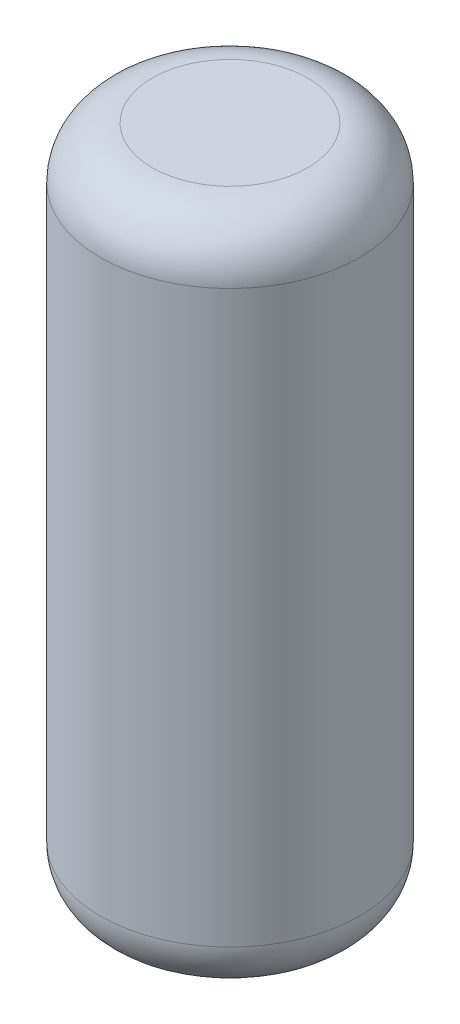
ISO-10303-21;
HEADER;
FILE_DESCRIPTION(('STEP AP214'),'2;1');
FILE_NAME('part.step','',(''),(''),'','','');
FILE_SCHEMA(('AUTOMOTIVE_DESIGN { 1 0 10303 214 1 1 1 1 }'));
ENDSEC;
DATA;
#1=APPLICATION_CONTEXT('core data for automotive mechanical design processes');
#2=APPLICATION_PROTOCOL_DEFINITION('international standard','automotive_design',2000,#1);
#3=PRODUCT_CONTEXT('',#1,'mechanical');
#4=PRODUCT('Part','Part','',(#3));
#5=PRODUCT_RELATED_PRODUCT_CATEGORY('part','',(#4));
#6=PRODUCT_DEFINITION_FORMATION('','',#4);
#7=PRODUCT_DEFINITION_CONTEXT('part definition',#1,'design');
#8=PRODUCT_DEFINITION('design','',#6,#7);
#9=PRODUCT_DEFINITION_SHAPE('','',#8);
#10=(LENGTH_UNIT() NAMED_UNIT(*) SI_UNIT(.MILLI.,.METRE.));
#11=(NAMED_UNIT(*) PLANE_ANGLE_UNIT() SI_UNIT($,.RADIAN.));
#12=(NAMED_UNIT(*) SI_UNIT($,.STERADIAN.) SOLID_ANGLE_UNIT());
#13=UNCERTAINTY_MEASURE_WITH_UNIT(LENGTH_MEASURE(1.E-05),#10,'distance_accuracy_value','');
#14=(GEOMETRIC_REPRESENTATION_CONTEXT(3) GLOBAL_UNCERTAINTY_ASSIGNED_CONTEXT((#13)) GLOBAL_UNIT_ASSIGNED_CONTEXT((#10,
#11,#12)) REPRESENTATION_CONTEXT('',''));
#15=CARTESIAN_POINT('',(0.,0.,0.));
#16=DIRECTION('',(0.,0.,1.));
#17=DIRECTION('',(1.,0.,0.));
#18=AXIS2_PLACEMENT_3D('',#15,#16,#17);
#19=CARTESIAN_POINT('',(0.,13.,0.));
#20=DIRECTION('',(0.,-1.,0.));
#21=DIRECTION('',(0.,0.,-1.));
#22=AXIS2_PLACEMENT_3D('',#19,#20,#21);
#23=CYLINDRICAL_SURFACE('',#22,2.5);
#24=CARTESIAN_POINT('',(0.,0.999999999999997,0.));
#25=DIRECTION('',(0.,1.,0.));
#26=DIRECTION('',(0.,0.,1.));
#27=AXIS2_PLACEMENT_3D('',#24,#25,#26);
#28=CIRCLE('',#27,2.5);
#29=CARTESIAN_POINT('',(0.,0.999999999999997,-2.5));
#30=VERTEX_POINT('',#29);
#31=EDGE_CURVE('E42',#30,#30,#28,.T.);
#32=CARTESIAN_POINT('',(0.,12.,0.));
#33=DIRECTION('',(0.,1.,0.));
#34=DIRECTION('',(0.,0.,1.));
#35=AXIS2_PLACEMENT_3D('',#32,#33,#34);
#36=CIRCLE('',#35,2.5);
#37=CARTESIAN_POINT('',(0.,12.,-2.5));
#38=VERTEX_POINT('',#37);
#39=EDGE_CURVE('E46',#38,#38,#36,.F.);
#40=CARTESIAN_POINT('',(0.,0.999999999999997,-2.5));
#41=CARTESIAN_POINT('',(0.,1.11458333333333,-2.5));
#42=CARTESIAN_POINT('',(0.,1.22916666666666,-2.5));
#43=CARTESIAN_POINT('',(0.,1.45833333333333,-2.5));
#44=CARTESIAN_POINT('',(0.,1.57291666666666,-2.5));
#45=CARTESIAN_POINT('',(0.,1.80208333333333,-2.5));
#46=CARTESIAN_POINT('',(0.,1.91666666666666,-2.5));
#47=CARTESIAN_POINT('',(0.,2.14583333333333,-2.5));
#48=CARTESIAN_POINT('',(0.,2.26041666666667,-2.5));
#49=CARTESIAN_POINT('',(0.,2.48958333333333,-2.5));
#50=CARTESIAN_POINT('',(0.,2.60416666666666,-2.5));
#51=CARTESIAN_POINT('',(0.,2.83333333333333,-2.5));
#52=CARTESIAN_POINT('',(0.,2.94791666666666,-2.5));
#53=CARTESIAN_POINT('',(0.,3.17708333333333,-2.5));
#54=CARTESIAN_POINT('',(0.,3.29166666666666,-2.5));
#55=CARTESIAN_POINT('',(0.,3.52083333333333,-2.5));
#56=CARTESIAN_POINT('',(0.,3.63541666666666,-2.5));
#57=CARTESIAN_POINT('',(0.,3.86458333333333,-2.5));
#58=CARTESIAN_POINT('',(0.,3.97916666666666,-2.5));
#59=CARTESIAN_POINT('',(0.,4.20833333333333,-2.5));
#60=CARTESIAN_POINT('',(0.,4.32291666666667,-2.5));
#61=CARTESIAN_POINT('',(0.,4.55208333333333,-2.5));
#62=CARTESIAN_POINT('',(0.,4.66666666666666,-2.5));
#63=CARTESIAN_POINT('',(0.,4.89583333333333,-2.5));
#64=CARTESIAN_POINT('',(0.,5.01041666666666,-2.5));
#65=CARTESIAN_POINT('',(0.,5.23958333333333,-2.5));
#66=CARTESIAN_POINT('',(0.,5.35416666666666,-2.5));
#67=CARTESIAN_POINT('',(0.,5.58333333333333,-2.5));
#68=CARTESIAN_POINT('',(0.,5.69791666666666,-2.5));
#69=CARTESIAN_POINT('',(0.,5.92708333333333,-2.5));
#70=CARTESIAN_POINT('',(0.,6.04166666666666,-2.5));
#71=CARTESIAN_POINT('',(0.,6.27083333333333,-2.5));
#72=CARTESIAN_POINT('',(0.,6.38541666666666,-2.5));
#73=CARTESIAN_POINT('',(0.,6.61458333333333,-2.5));
#74=CARTESIAN_POINT('',(0.,6.72916666666666,-2.5));
#75=CARTESIAN_POINT('',(0.,6.95833333333333,-2.5));
#76=CARTESIAN_POINT('',(0.,7.07291666666667,-2.5));
#77=CARTESIAN_POINT('',(0.,7.30208333333333,-2.5));
#78=CARTESIAN_POINT('',(0.,7.41666666666667,-2.5));
#79=CARTESIAN_POINT('',(0.,7.64583333333333,-2.5));
#80=CARTESIAN_POINT('',(0.,7.76041666666666,-2.5));
#81=CARTESIAN_POINT('',(0.,7.98958333333333,-2.5));
#82=CARTESIAN_POINT('',(0.,8.10416666666667,-2.5));
#83=CARTESIAN_POINT('',(0.,8.33333333333333,-2.5));
#84=CARTESIAN_POINT('',(0.,8.44791666666666,-2.5));
#85=CARTESIAN_POINT('',(0.,8.67708333333333,-2.5));
#86=CARTESIAN_POINT('',(0.,8.79166666666666,-2.5));
#87=CARTESIAN_POINT('',(0.,9.02083333333333,-2.5));
#88=CARTESIAN_POINT('',(0.,9.13541666666666,-2.5));
#89=CARTESIAN_POINT('',(0.,9.36458333333333,-2.5));
#90=CARTESIAN_POINT('',(0.,9.47916666666667,-2.5));
#91=CARTESIAN_POINT('',(0.,9.70833333333333,-2.5));
#92=CARTESIAN_POINT('',(0.,9.82291666666667,-2.5));
#93=CARTESIAN_POINT('',(0.,10.0520833333333,-2.5));
#94=CARTESIAN_POINT('',(0.,10.1666666666667,-2.5));
#95=CARTESIAN_POINT('',(0.,10.3958333333333,-2.5));
#96=CARTESIAN_POINT('',(0.,10.5104166666667,-2.5));
#97=CARTESIAN_POINT('',(0.,10.7395833333333,-2.5));
#98=CARTESIAN_POINT('',(0.,10.8541666666667,-2.5));
#99=CARTESIAN_POINT('',(0.,11.0833333333333,-2.5));
#100=CARTESIAN_POINT('',(0.,11.1979166666667,-2.5));
#101=CARTESIAN_POINT('',(0.,11.4270833333333,-2.5));
#102=CARTESIAN_POINT('',(0.,11.5416666666667,-2.5));
#103=CARTESIAN_POINT('',(0.,11.7708333333333,-2.5));
#104=CARTESIAN_POINT('',(0.,11.8854166666667,-2.5));
#105=CARTESIAN_POINT('',(0.,12.,-2.5));
#106=B_SPLINE_CURVE_WITH_KNOTS('',3,(#40,#41,#42,#43,#44,#45,#46,#47,#48,#49,#50,#51,#52,#53,
#54,#55,#56,#57,#58,#59,#60,#61,#62,#63,#64,#65,#66,#67,#68,#69,#70,#71,#72,#73,#74,#75,#76,#77,
#78,#79,#80,#81,#82,#83,#84,#85,#86,#87,#88,#89,#90,#91,#92,#93,#94,#95,#96,#97,#98,#99,#100,
#101,#102,#103,#104,#105),.UNSPECIFIED.,.F.,.F.,(4,2,2,2,2,2,2,2,2,2,2,2,2,2,2,2,2,2,2,2,2,2,2,
2,2,2,2,2,2,2,2,2,4),(0.,0.34375,0.687500000000001,1.03125,1.375,1.71875,2.0625,2.40625,2.75,
3.09375,3.4375,3.78125,4.125,4.46875,4.8125,5.15625,5.5,5.84375,6.1875,6.53125,6.875,7.21875,
7.5625,7.90625,8.25,8.59375,8.9375,9.28125,9.625,9.96875,10.3125,10.65625,11.),.UNSPECIFIED.);
#107=EDGE_CURVE('BSEAM31',#30,#38,#106,.T.);
#108=ORIENTED_EDGE('',*,*,#31,.T.);
#109=ORIENTED_EDGE('',*,*,#39,.T.);
#110=ORIENTED_EDGE('',*,*,#107,.T.);
#111=ORIENTED_EDGE('',*,*,#107,.F.);
#112=EDGE_LOOP('',(#108,#110,#109,#111));
#113=FACE_BOUND('',#112,.T.);
#114=ADVANCED_FACE('F31',(#113),#23,.T.);
#115=CARTESIAN_POINT('',(0.,13.,0.));
#116=DIRECTION('',(0.,1.,0.));
#117=DIRECTION('',(0.,0.,1.));
#118=AXIS2_PLACEMENT_3D('',#115,#116,#117);
#119=PLANE('',#118);
#120=CARTESIAN_POINT('',(0.,13.,0.));
#121=DIRECTION('',(0.,1.,0.));
#122=DIRECTION('',(0.,0.,1.));
#123=AXIS2_PLACEMENT_3D('',#120,#121,#122);
#124=CIRCLE('',#123,1.5);
#125=CARTESIAN_POINT('',(0.,13.,1.5));
#126=VERTEX_POINT('',#125);
#127=EDGE_CURVE('E10',#126,#126,#124,.T.);
#128=ORIENTED_EDGE('',*,*,#127,.T.);
#129=EDGE_LOOP('',(#128));
#130=FACE_BOUND('',#129,.T.);
#131=ADVANCED_FACE('F62',(#130),#119,.T.);
#132=CARTESIAN_POINT('',(0.,0.,0.));
#133=DIRECTION('',(0.,1.,0.));
#134=DIRECTION('',(0.,0.,1.));
#135=AXIS2_PLACEMENT_3D('',#132,#133,#134);
#136=PLANE('',#135);
#137=CARTESIAN_POINT('',(0.,0.,0.));
#138=DIRECTION('',(0.,1.,0.));
#139=DIRECTION('',(0.,0.,1.));
#140=AXIS2_PLACEMENT_3D('',#137,#138,#139);
#141=CIRCLE('',#140,1.5);
#142=CARTESIAN_POINT('',(0.,0.,1.5));
#143=VERTEX_POINT('',#142);
#144=EDGE_CURVE('E38',#143,#143,#141,.F.);
#145=ORIENTED_EDGE('',*,*,#144,.T.);
#146=EDGE_LOOP('',(#145));
#147=FACE_BOUND('',#146,.T.);
#148=ADVANCED_FACE('F59',(#147),#136,.F.);
#149=CARTESIAN_POINT('',(0.,0.999999999999999,0.));
#150=DIRECTION('',(0.,1.,0.));
#151=DIRECTION('',(0.,0.,1.));
#152=AXIS2_PLACEMENT_3D('',#149,#150,#151);
#153=TOROIDAL_SURFACE('',#152,1.5,1.);
#154=ORIENTED_EDGE('',*,*,#144,.F.);
#155=EDGE_LOOP('',(#154));
#156=FACE_BOUND('',#155,.T.);
#157=ORIENTED_EDGE('',*,*,#31,.F.);
#158=EDGE_LOOP('',(#157));
#159=FACE_BOUND('',#158,.T.);
#160=ADVANCED_FACE('F55',(#156,#159),#153,.T.);
#161=CARTESIAN_POINT('',(0.,12.,0.));
#162=DIRECTION('',(0.,1.,0.));
#163=DIRECTION('',(0.,0.,1.));
#164=AXIS2_PLACEMENT_3D('',#161,#162,#163);
#165=TOROIDAL_SURFACE('',#164,1.5,1.);
#166=ORIENTED_EDGE('',*,*,#39,.F.);
#167=EDGE_LOOP('',(#166));
#168=FACE_BOUND('',#167,.T.);
#169=ORIENTED_EDGE('',*,*,#127,.F.);
#170=EDGE_LOOP('',(#169));
#171=FACE_BOUND('',#170,.T.);
#172=ADVANCED_FACE('F33',(#168,#171),#165,.T.);
#173=CLOSED_SHELL('',(#114,#131,#148,#160,#172));
#174=MANIFOLD_SOLID_BREP('B2',#173);
#175=ADVANCED_BREP_SHAPE_REPRESENTATION('',(#18,#174),#14);
#176=SHAPE_DEFINITION_REPRESENTATION(#9,#175);
ENDSEC;
END-ISO-10303-21;
